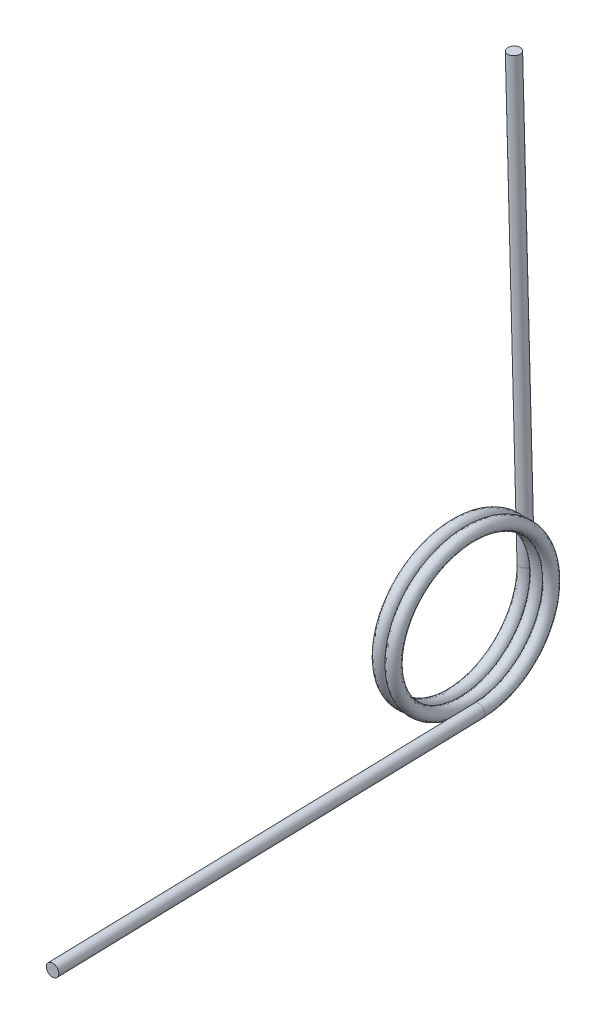
ISO-10303-21;
HEADER;
FILE_DESCRIPTION(('STEP AP214'),'2;1');
FILE_NAME('part.step','',(''),(''),'','','');
FILE_SCHEMA(('AUTOMOTIVE_DESIGN { 1 0 10303 214 1 1 1 1 }'));
ENDSEC;
DATA;
#1=APPLICATION_CONTEXT('core data for automotive mechanical design processes');
#2=APPLICATION_PROTOCOL_DEFINITION('international standard','automotive_design',2000,#1);
#3=PRODUCT_CONTEXT('',#1,'mechanical');
#4=PRODUCT('Part','Part','',(#3));
#5=PRODUCT_RELATED_PRODUCT_CATEGORY('part','',(#4));
#6=PRODUCT_DEFINITION_FORMATION('','',#4);
#7=PRODUCT_DEFINITION_CONTEXT('part definition',#1,'design');
#8=PRODUCT_DEFINITION('design','',#6,#7);
#9=PRODUCT_DEFINITION_SHAPE('','',#8);
#10=(LENGTH_UNIT() NAMED_UNIT(*) SI_UNIT(.MILLI.,.METRE.));
#11=(NAMED_UNIT(*) PLANE_ANGLE_UNIT() SI_UNIT($,.RADIAN.));
#12=(NAMED_UNIT(*) SI_UNIT($,.STERADIAN.) SOLID_ANGLE_UNIT());
#13=UNCERTAINTY_MEASURE_WITH_UNIT(LENGTH_MEASURE(1.E-05),#10,'distance_accuracy_value','');
#14=(GEOMETRIC_REPRESENTATION_CONTEXT(3) GLOBAL_UNCERTAINTY_ASSIGNED_CONTEXT((#13)) GLOBAL_UNIT_ASSIGNED_CONTEXT((#10,
#11,#12)) REPRESENTATION_CONTEXT('',''));
#15=CARTESIAN_POINT('',(0.,0.,0.));
#16=DIRECTION('',(0.,0.,1.));
#17=DIRECTION('',(1.,0.,0.));
#18=AXIS2_PLACEMENT_3D('',#15,#16,#17);
#19=CARTESIAN_POINT('',(-0.35547277961464,-4.3815,0.00951120145095867));
#20=CARTESIAN_POINT('',(-0.416856112947973,-4.38699129471803,-2.52014900300339));
#21=CARTESIAN_POINT('',(-0.478239446281306,-2.19898694207704,-3.78973470595604));
#22=CARTESIAN_POINT('',(-0.53962277961464,-0.0109825894360558,-5.05932040890869));
#23=CARTESIAN_POINT('',(-0.601006112947973,2.18251305792296,-3.799245907407));
#24=CARTESIAN_POINT('',(-0.662389446281306,4.37600870528197,-2.53917140590531));
#25=CARTESIAN_POINT('',(-0.723772779614639,4.3815,-0.0095112014509592));
#26=CARTESIAN_POINT('',(-0.785156112947972,4.38699129471803,2.52014900300339));
#27=CARTESIAN_POINT('',(-0.846539446281306,2.19898694207704,3.78973470595604));
#28=CARTESIAN_POINT('',(-0.907922779614639,0.0109825894360564,5.05932040890869));
#29=CARTESIAN_POINT('',(-0.969306112947972,-2.18251305792296,3.799245907407));
#30=CARTESIAN_POINT('',(-1.0306894462813,-4.37600870528197,2.53917140590531));
#31=CARTESIAN_POINT('',(-1.09207277961464,-4.3815,0.00951120145095867));
#32=CARTESIAN_POINT('',(-1.15345611294797,-4.38699129471803,-2.52014900300339));
#33=CARTESIAN_POINT('',(-1.2148394462813,-2.19898694207704,-3.78973470595604));
#34=CARTESIAN_POINT('',(-1.27622277961464,-0.0109825894360558,-5.05932040890869));
#35=CARTESIAN_POINT('',(-1.33760611294797,2.18251305792296,-3.799245907407));
#36=CARTESIAN_POINT('',(-1.3989894462813,4.37600870528197,-2.53917140590531));
#37=CARTESIAN_POINT('',(-1.46037277961464,4.3815,-0.0095112014509592));
#38=CARTESIAN_POINT('',(-1.52175611294797,4.38699129471803,2.52014900300339));
#39=CARTESIAN_POINT('',(-1.5831394462813,2.19898694207704,3.78973470595604));
#40=CARTESIAN_POINT('',(-1.64452277961464,0.0109825894360564,5.05932040890869));
#41=CARTESIAN_POINT('',(-1.70590611294797,-2.18251305792296,3.799245907407));
#42=CARTESIAN_POINT('',(-1.7672894462813,-4.37600870528197,2.53917140590531));
#43=CARTESIAN_POINT('',(-1.82867277961464,-4.3815,0.00951120145095867));
#44=CARTESIAN_POINT('',(-1.89005611294797,-4.38699129471803,-2.52014900300339));
#45=CARTESIAN_POINT('',(-1.9514394462813,-2.19898694207704,-3.78973470595604));
#46=CARTESIAN_POINT('',(-2.01282277961464,-0.0109825894360558,-5.05932040890869));
#47=CARTESIAN_POINT('',(-2.07420611294797,2.18251305792296,-3.799245907407));
#48=CARTESIAN_POINT('',(-2.1355894462813,4.37600870528197,-2.53917140590531));
#49=CARTESIAN_POINT('',(-2.19697277961464,4.3815,-0.0095112014509592));
#50=CARTESIAN_POINT('',(-2.25835611294797,4.38699129471803,2.52014900300339));
#51=CARTESIAN_POINT('',(-2.3197394462813,2.19898694207704,3.78973470595604));
#52=CARTESIAN_POINT('',(-2.38112277961464,0.0109825894360564,5.05932040890869));
#53=CARTESIAN_POINT('',(-2.44250611294797,-2.18251305792296,3.799245907407));
#54=CARTESIAN_POINT('',(-2.5038894462813,-4.37600870528197,2.53917140590531));
#55=CARTESIAN_POINT('',(-2.56527277961463,-4.3815,0.00951120145095867));
#56=CARTESIAN_POINT('',(-0.35547277961464,-3.6703,0.00951120145096624));
#57=CARTESIAN_POINT('',(-0.416856112947973,-3.67579129471803,-2.10953749155572));
#58=CARTESIAN_POINT('',(-0.478239446281306,-1.84338694207705,-3.17381743878454));
#59=CARTESIAN_POINT('',(-0.539622779614639,-0.0109825894360645,-4.23809738601337));
#60=CARTESIAN_POINT('',(-0.601006112947973,1.82691305792295,-3.18332864023551));
#61=CARTESIAN_POINT('',(-0.662389446281306,3.66480870528197,-2.12855989445765));
#62=CARTESIAN_POINT('',(-0.723772779614639,3.6703,-0.00951120145096669));
#63=CARTESIAN_POINT('',(-0.785156112947972,3.67579129471804,2.10953749155572));
#64=CARTESIAN_POINT('',(-0.846539446281305,1.84338694207705,3.17381743878454));
#65=CARTESIAN_POINT('',(-0.907922779614639,0.010982589436065,4.23809738601337));
#66=CARTESIAN_POINT('',(-0.969306112947972,-1.82691305792295,3.18332864023551));
#67=CARTESIAN_POINT('',(-1.0306894462813,-3.66480870528197,2.12855989445765));
#68=CARTESIAN_POINT('',(-1.09207277961464,-3.6703,0.00951120145096624));
#69=CARTESIAN_POINT('',(-1.15345611294797,-3.67579129471803,-2.10953749155572));
#70=CARTESIAN_POINT('',(-1.2148394462813,-1.84338694207705,-3.17381743878454));
#71=CARTESIAN_POINT('',(-1.27622277961464,-0.0109825894360645,-4.23809738601337));
#72=CARTESIAN_POINT('',(-1.33760611294797,1.82691305792295,-3.18332864023551));
#73=CARTESIAN_POINT('',(-1.3989894462813,3.66480870528197,-2.12855989445765));
#74=CARTESIAN_POINT('',(-1.46037277961464,3.6703,-0.00951120145096669));
#75=CARTESIAN_POINT('',(-1.52175611294797,3.67579129471804,2.10953749155572));
#76=CARTESIAN_POINT('',(-1.5831394462813,1.84338694207705,3.17381743878454));
#77=CARTESIAN_POINT('',(-1.64452277961464,0.010982589436065,4.23809738601337));
#78=CARTESIAN_POINT('',(-1.70590611294797,-1.82691305792295,3.18332864023551));
#79=CARTESIAN_POINT('',(-1.7672894462813,-3.66480870528197,2.12855989445765));
#80=CARTESIAN_POINT('',(-1.82867277961464,-3.6703,0.00951120145096624));
#81=CARTESIAN_POINT('',(-1.89005611294797,-3.67579129471803,-2.10953749155572));
#82=CARTESIAN_POINT('',(-1.9514394462813,-1.84338694207705,-3.17381743878454));
#83=CARTESIAN_POINT('',(-2.01282277961464,-0.0109825894360645,-4.23809738601337));
#84=CARTESIAN_POINT('',(-2.07420611294797,1.82691305792295,-3.18332864023551));
#85=CARTESIAN_POINT('',(-2.1355894462813,3.66480870528197,-2.12855989445765));
#86=CARTESIAN_POINT('',(-2.19697277961464,3.6703,-0.00951120145096669));
#87=CARTESIAN_POINT('',(-2.25835611294797,3.67579129471804,2.10953749155572));
#88=CARTESIAN_POINT('',(-2.3197394462813,1.84338694207705,3.17381743878454));
#89=CARTESIAN_POINT('',(-2.38112277961464,0.010982589436065,4.23809738601337));
#90=CARTESIAN_POINT('',(-2.44250611294797,-1.82691305792295,3.18332864023551));
#91=CARTESIAN_POINT('',(-2.5038894462813,-3.66480870528197,2.12855989445765));
#92=CARTESIAN_POINT('',(-2.56527277961463,-3.6703,0.00951120145096624));
#93=CARTESIAN_POINT('',(0.35547277961464,-3.6703,-0.00951120145104288));
#94=CARTESIAN_POINT('',(0.294089446281307,-3.66480870528193,-2.12855989445773));
#95=CARTESIAN_POINT('',(0.232706112947974,-1.82691305792289,-3.18332864023555));
#96=CARTESIAN_POINT('',(0.171322779614641,0.0109825894361525,-4.23809738601337));
#97=CARTESIAN_POINT('',(0.109939446281307,1.84338694207711,-3.17381743878451));
#98=CARTESIAN_POINT('',(0.0485561129479742,3.67579129471808,-2.10953749155564));
#99=CARTESIAN_POINT('',(-0.012827220385359,3.6703,0.00951120145104243));
#100=CARTESIAN_POINT('',(-0.0742105537186922,3.66480870528193,2.12855989445773));
#101=CARTESIAN_POINT('',(-0.135593887052025,1.82691305792289,3.18332864023555));
#102=CARTESIAN_POINT('',(-0.196977220385359,-0.0109825894361519,4.23809738601337));
#103=CARTESIAN_POINT('',(-0.258360553718692,-1.84338694207711,3.17381743878451));
#104=CARTESIAN_POINT('',(-0.319743887052025,-3.67579129471808,2.10953749155564));
#105=CARTESIAN_POINT('',(-0.381127220385358,-3.6703,-0.00951120145104288));
#106=CARTESIAN_POINT('',(-0.442510553718691,-3.66480870528193,-2.12855989445773));
#107=CARTESIAN_POINT('',(-0.503893887052025,-1.82691305792289,-3.18332864023555));
#108=CARTESIAN_POINT('',(-0.565277220385358,0.0109825894361525,-4.23809738601337));
#109=CARTESIAN_POINT('',(-0.626660553718691,1.84338694207711,-3.17381743878451));
#110=CARTESIAN_POINT('',(-0.688043887052024,3.67579129471808,-2.10953749155564));
#111=CARTESIAN_POINT('',(-0.749427220385357,3.6703,0.00951120145104243));
#112=CARTESIAN_POINT('',(-0.810810553718691,3.66480870528193,2.12855989445773));
#113=CARTESIAN_POINT('',(-0.872193887052024,1.82691305792289,3.18332864023555));
#114=CARTESIAN_POINT('',(-0.933577220385357,-0.0109825894361519,4.23809738601337));
#115=CARTESIAN_POINT('',(-0.99496055371869,-1.84338694207711,3.17381743878451));
#116=CARTESIAN_POINT('',(-1.05634388705202,-3.67579129471808,2.10953749155564));
#117=CARTESIAN_POINT('',(-1.11772722038536,-3.6703,-0.00951120145104288));
#118=CARTESIAN_POINT('',(-1.17911055371869,-3.66480870528193,-2.12855989445773));
#119=CARTESIAN_POINT('',(-1.24049388705202,-1.82691305792289,-3.18332864023555));
#120=CARTESIAN_POINT('',(-1.30187722038536,0.0109825894361525,-4.23809738601337));
#121=CARTESIAN_POINT('',(-1.36326055371869,1.84338694207711,-3.17381743878451));
#122=CARTESIAN_POINT('',(-1.42464388705202,3.67579129471808,-2.10953749155564));
#123=CARTESIAN_POINT('',(-1.48602722038536,3.6703,0.00951120145104243));
#124=CARTESIAN_POINT('',(-1.54741055371869,3.66480870528193,2.12855989445773));
#125=CARTESIAN_POINT('',(-1.60879388705202,1.82691305792289,3.18332864023555));
#126=CARTESIAN_POINT('',(-1.67017722038536,-0.0109825894361519,4.23809738601337));
#127=CARTESIAN_POINT('',(-1.73156055371869,-1.84338694207711,3.17381743878451));
#128=CARTESIAN_POINT('',(-1.79294388705202,-3.67579129471808,2.10953749155564));
#129=CARTESIAN_POINT('',(-1.85432722038535,-3.6703,-0.00951120145104288));
#130=CARTESIAN_POINT('',(0.35547277961464,-4.3815,-0.00951120145105045));
#131=CARTESIAN_POINT('',(0.294089446281307,-4.37600870528192,-2.5391714059054));
#132=CARTESIAN_POINT('',(0.232706112947974,-2.18251305792288,-3.79924590740704));
#133=CARTESIAN_POINT('',(0.17132277961464,0.0109825894361612,-5.05932040890869));
#134=CARTESIAN_POINT('',(0.109939446281307,2.19898694207712,-3.78973470595599));
#135=CARTESIAN_POINT('',(0.0485561129479741,4.38699129471808,-2.5201490030033));
#136=CARTESIAN_POINT('',(-0.0128272203853591,4.3815,0.00951120145104991));
#137=CARTESIAN_POINT('',(-0.0742105537186923,4.37600870528192,2.5391714059054));
#138=CARTESIAN_POINT('',(-0.135593887052026,2.18251305792288,3.79924590740704));
#139=CARTESIAN_POINT('',(-0.196977220385359,-0.0109825894361605,5.05932040890869));
#140=CARTESIAN_POINT('',(-0.258360553718692,-2.19898694207712,3.789734705956));
#141=CARTESIAN_POINT('',(-0.319743887052025,-4.38699129471808,2.5201490030033));
#142=CARTESIAN_POINT('',(-0.381127220385358,-4.3815,-0.00951120145105045));
#143=CARTESIAN_POINT('',(-0.442510553718692,-4.37600870528192,-2.5391714059054));
#144=CARTESIAN_POINT('',(-0.503893887052025,-2.18251305792288,-3.79924590740704));
#145=CARTESIAN_POINT('',(-0.565277220385358,0.0109825894361612,-5.05932040890869));
#146=CARTESIAN_POINT('',(-0.626660553718691,2.19898694207712,-3.78973470595599));
#147=CARTESIAN_POINT('',(-0.688043887052024,4.38699129471808,-2.5201490030033));
#148=CARTESIAN_POINT('',(-0.749427220385357,4.3815,0.00951120145104991));
#149=CARTESIAN_POINT('',(-0.810810553718691,4.37600870528192,2.5391714059054));
#150=CARTESIAN_POINT('',(-0.872193887052024,2.18251305792288,3.79924590740704));
#151=CARTESIAN_POINT('',(-0.933577220385357,-0.0109825894361605,5.05932040890869));
#152=CARTESIAN_POINT('',(-0.99496055371869,-2.19898694207712,3.789734705956));
#153=CARTESIAN_POINT('',(-1.05634388705202,-4.38699129471808,2.5201490030033));
#154=CARTESIAN_POINT('',(-1.11772722038536,-4.3815,-0.00951120145105045));
#155=CARTESIAN_POINT('',(-1.17911055371869,-4.37600870528192,-2.5391714059054));
#156=CARTESIAN_POINT('',(-1.24049388705202,-2.18251305792288,-3.79924590740704));
#157=CARTESIAN_POINT('',(-1.30187722038536,0.0109825894361612,-5.05932040890869));
#158=CARTESIAN_POINT('',(-1.36326055371869,2.19898694207712,-3.78973470595599));
#159=CARTESIAN_POINT('',(-1.42464388705202,4.38699129471808,-2.5201490030033));
#160=CARTESIAN_POINT('',(-1.48602722038536,4.3815,0.00951120145104991));
#161=CARTESIAN_POINT('',(-1.54741055371869,4.37600870528192,2.5391714059054));
#162=CARTESIAN_POINT('',(-1.60879388705202,2.18251305792288,3.79924590740704));
#163=CARTESIAN_POINT('',(-1.67017722038536,-0.0109825894361605,5.05932040890869));
#164=CARTESIAN_POINT('',(-1.73156055371869,-2.19898694207712,3.789734705956));
#165=CARTESIAN_POINT('',(-1.79294388705202,-4.38699129471808,2.5201490030033));
#166=CARTESIAN_POINT('',(-1.85432722038535,-4.3815,-0.00951120145105045));
#167=CARTESIAN_POINT('',(0.35547277961464,-5.0927,-0.00951120145105802));
#168=CARTESIAN_POINT('',(0.294089446281307,-5.08720870528192,-2.94978291735307));
#169=CARTESIAN_POINT('',(0.232706112947974,-2.53811305792287,-4.41516317457854));
#170=CARTESIAN_POINT('',(0.17132277961464,0.0109825894361699,-5.88054343180402));
#171=CARTESIAN_POINT('',(0.109939446281307,2.55458694207713,-4.40565197312748));
#172=CARTESIAN_POINT('',(0.0485561129479739,5.09819129471809,-2.93076051445095));
#173=CARTESIAN_POINT('',(-0.0128272203853592,5.0927,0.0095112014510574));
#174=CARTESIAN_POINT('',(-0.0742105537186924,5.08720870528192,2.94978291735306));
#175=CARTESIAN_POINT('',(-0.135593887052026,2.53811305792288,4.41516317457854));
#176=CARTESIAN_POINT('',(-0.196977220385359,-0.0109825894361691,5.88054343180402));
#177=CARTESIAN_POINT('',(-0.258360553718692,-2.55458694207713,4.40565197312749));
#178=CARTESIAN_POINT('',(-0.319743887052025,-5.09819129471809,2.93076051445095));
#179=CARTESIAN_POINT('',(-0.381127220385358,-5.0927,-0.00951120145105802));
#180=CARTESIAN_POINT('',(-0.442510553718692,-5.08720870528192,-2.94978291735307));
#181=CARTESIAN_POINT('',(-0.503893887052025,-2.53811305792287,-4.41516317457854));
#182=CARTESIAN_POINT('',(-0.565277220385358,0.0109825894361699,-5.88054343180402));
#183=CARTESIAN_POINT('',(-0.626660553718691,2.55458694207713,-4.40565197312748));
#184=CARTESIAN_POINT('',(-0.688043887052024,5.09819129471809,-2.93076051445095));
#185=CARTESIAN_POINT('',(-0.749427220385358,5.0927,0.0095112014510574));
#186=CARTESIAN_POINT('',(-0.810810553718691,5.08720870528192,2.94978291735306));
#187=CARTESIAN_POINT('',(-0.872193887052024,2.53811305792288,4.41516317457854));
#188=CARTESIAN_POINT('',(-0.933577220385357,-0.0109825894361691,5.88054343180402));
#189=CARTESIAN_POINT('',(-0.99496055371869,-2.55458694207713,4.40565197312749));
#190=CARTESIAN_POINT('',(-1.05634388705202,-5.09819129471809,2.93076051445095));
#191=CARTESIAN_POINT('',(-1.11772722038536,-5.0927,-0.00951120145105802));
#192=CARTESIAN_POINT('',(-1.17911055371869,-5.08720870528192,-2.94978291735307));
#193=CARTESIAN_POINT('',(-1.24049388705202,-2.53811305792287,-4.41516317457854));
#194=CARTESIAN_POINT('',(-1.30187722038536,0.0109825894361699,-5.88054343180402));
#195=CARTESIAN_POINT('',(-1.36326055371869,2.55458694207713,-4.40565197312748));
#196=CARTESIAN_POINT('',(-1.42464388705202,5.09819129471809,-2.93076051445095));
#197=CARTESIAN_POINT('',(-1.48602722038536,5.0927,0.0095112014510574));
#198=CARTESIAN_POINT('',(-1.54741055371869,5.08720870528192,2.94978291735306));
#199=CARTESIAN_POINT('',(-1.60879388705202,2.53811305792288,4.41516317457854));
#200=CARTESIAN_POINT('',(-1.67017722038536,-0.0109825894361691,5.88054343180402));
#201=CARTESIAN_POINT('',(-1.73156055371869,-2.55458694207713,4.40565197312749));
#202=CARTESIAN_POINT('',(-1.79294388705202,-5.09819129471809,2.93076051445095));
#203=CARTESIAN_POINT('',(-1.85432722038536,-5.0927,-0.00951120145105802));
#204=CARTESIAN_POINT('',(-0.35547277961464,-5.0927,0.00951120145095109));
#205=CARTESIAN_POINT('',(-0.416856112947973,-5.09819129471803,-2.93076051445106));
#206=CARTESIAN_POINT('',(-0.478239446281307,-2.55458694207704,-4.40565197312754));
#207=CARTESIAN_POINT('',(-0.53962277961464,-0.0109825894360471,-5.88054343180402));
#208=CARTESIAN_POINT('',(-0.601006112947973,2.53811305792296,-4.41516317457849));
#209=CARTESIAN_POINT('',(-0.662389446281306,5.08720870528198,-2.94978291735296));
#210=CARTESIAN_POINT('',(-0.723772779614639,5.0927,-0.00951120145095172));
#211=CARTESIAN_POINT('',(-0.785156112947972,5.09819129471803,2.93076051445106));
#212=CARTESIAN_POINT('',(-0.846539446281306,2.55458694207704,4.40565197312753));
#213=CARTESIAN_POINT('',(-0.907922779614639,0.0109825894360478,5.88054343180402));
#214=CARTESIAN_POINT('',(-0.969306112947972,-2.53811305792296,4.41516317457849));
#215=CARTESIAN_POINT('',(-1.03068944628131,-5.08720870528198,2.94978291735296));
#216=CARTESIAN_POINT('',(-1.09207277961464,-5.0927,0.00951120145095109));
#217=CARTESIAN_POINT('',(-1.15345611294797,-5.09819129471803,-2.93076051445106));
#218=CARTESIAN_POINT('',(-1.21483944628131,-2.55458694207704,-4.40565197312754));
#219=CARTESIAN_POINT('',(-1.27622277961464,-0.0109825894360471,-5.88054343180402));
#220=CARTESIAN_POINT('',(-1.33760611294797,2.53811305792296,-4.41516317457849));
#221=CARTESIAN_POINT('',(-1.3989894462813,5.08720870528198,-2.94978291735296));
#222=CARTESIAN_POINT('',(-1.46037277961464,5.0927,-0.00951120145095172));
#223=CARTESIAN_POINT('',(-1.52175611294797,5.09819129471803,2.93076051445106));
#224=CARTESIAN_POINT('',(-1.5831394462813,2.55458694207704,4.40565197312753));
#225=CARTESIAN_POINT('',(-1.64452277961464,0.0109825894360478,5.88054343180402));
#226=CARTESIAN_POINT('',(-1.70590611294797,-2.53811305792296,4.41516317457849));
#227=CARTESIAN_POINT('',(-1.7672894462813,-5.08720870528198,2.94978291735296));
#228=CARTESIAN_POINT('',(-1.82867277961464,-5.0927,0.00951120145095109));
#229=CARTESIAN_POINT('',(-1.89005611294797,-5.09819129471803,-2.93076051445106));
#230=CARTESIAN_POINT('',(-1.9514394462813,-2.55458694207704,-4.40565197312754));
#231=CARTESIAN_POINT('',(-2.01282277961464,-0.0109825894360471,-5.88054343180402));
#232=CARTESIAN_POINT('',(-2.07420611294797,2.53811305792296,-4.41516317457849));
#233=CARTESIAN_POINT('',(-2.1355894462813,5.08720870528198,-2.94978291735296));
#234=CARTESIAN_POINT('',(-2.19697277961464,5.0927,-0.00951120145095172));
#235=CARTESIAN_POINT('',(-2.25835611294797,5.09819129471803,2.93076051445106));
#236=CARTESIAN_POINT('',(-2.3197394462813,2.55458694207704,4.40565197312753));
#237=CARTESIAN_POINT('',(-2.38112277961464,0.0109825894360478,5.88054343180402));
#238=CARTESIAN_POINT('',(-2.44250611294797,-2.53811305792296,4.41516317457849));
#239=CARTESIAN_POINT('',(-2.5038894462813,-5.08720870528198,2.94978291735296));
#240=CARTESIAN_POINT('',(-2.56527277961463,-5.0927,0.00951120145095109));
#241=CARTESIAN_POINT('',(-0.35547277961464,-4.3815,0.00951120145095867));
#242=CARTESIAN_POINT('',(-0.416856112947973,-4.38699129471803,-2.52014900300339));
#243=CARTESIAN_POINT('',(-0.478239446281306,-2.19898694207704,-3.78973470595604));
#244=CARTESIAN_POINT('',(-0.53962277961464,-0.0109825894360558,-5.05932040890869));
#245=CARTESIAN_POINT('',(-0.601006112947973,2.18251305792296,-3.799245907407));
#246=CARTESIAN_POINT('',(-0.662389446281306,4.37600870528197,-2.53917140590531));
#247=CARTESIAN_POINT('',(-0.723772779614639,4.3815,-0.0095112014509592));
#248=CARTESIAN_POINT('',(-0.785156112947972,4.38699129471803,2.52014900300339));
#249=CARTESIAN_POINT('',(-0.846539446281306,2.19898694207704,3.78973470595604));
#250=CARTESIAN_POINT('',(-0.907922779614639,0.0109825894360564,5.05932040890869));
#251=CARTESIAN_POINT('',(-0.969306112947972,-2.18251305792296,3.799245907407));
#252=CARTESIAN_POINT('',(-1.0306894462813,-4.37600870528197,2.53917140590531));
#253=CARTESIAN_POINT('',(-1.09207277961464,-4.3815,0.00951120145095867));
#254=CARTESIAN_POINT('',(-1.15345611294797,-4.38699129471803,-2.52014900300339));
#255=CARTESIAN_POINT('',(-1.2148394462813,-2.19898694207704,-3.78973470595604));
#256=CARTESIAN_POINT('',(-1.27622277961464,-0.0109825894360558,-5.05932040890869));
#257=CARTESIAN_POINT('',(-1.33760611294797,2.18251305792296,-3.799245907407));
#258=CARTESIAN_POINT('',(-1.3989894462813,4.37600870528197,-2.53917140590531));
#259=CARTESIAN_POINT('',(-1.46037277961464,4.3815,-0.0095112014509592));
#260=CARTESIAN_POINT('',(-1.52175611294797,4.38699129471803,2.52014900300339));
#261=CARTESIAN_POINT('',(-1.5831394462813,2.19898694207704,3.78973470595604));
#262=CARTESIAN_POINT('',(-1.64452277961464,0.0109825894360564,5.05932040890869));
#263=CARTESIAN_POINT('',(-1.70590611294797,-2.18251305792296,3.799245907407));
#264=CARTESIAN_POINT('',(-1.7672894462813,-4.37600870528197,2.53917140590531));
#265=CARTESIAN_POINT('',(-1.82867277961464,-4.3815,0.00951120145095867));
#266=CARTESIAN_POINT('',(-1.89005611294797,-4.38699129471803,-2.52014900300339));
#267=CARTESIAN_POINT('',(-1.9514394462813,-2.19898694207704,-3.78973470595604));
#268=CARTESIAN_POINT('',(-2.01282277961464,-0.0109825894360558,-5.05932040890869));
#269=CARTESIAN_POINT('',(-2.07420611294797,2.18251305792296,-3.799245907407));
#270=CARTESIAN_POINT('',(-2.1355894462813,4.37600870528197,-2.53917140590531));
#271=CARTESIAN_POINT('',(-2.19697277961464,4.3815,-0.0095112014509592));
#272=CARTESIAN_POINT('',(-2.25835611294797,4.38699129471803,2.52014900300339));
#273=CARTESIAN_POINT('',(-2.3197394462813,2.19898694207704,3.78973470595604));
#274=CARTESIAN_POINT('',(-2.38112277961464,0.0109825894360564,5.05932040890869));
#275=CARTESIAN_POINT('',(-2.44250611294797,-2.18251305792296,3.799245907407));
#276=CARTESIAN_POINT('',(-2.5038894462813,-4.37600870528197,2.53917140590531));
#277=CARTESIAN_POINT('',(-2.56527277961463,-4.3815,0.00951120145095867));
#278=(BOUNDED_SURFACE() B_SPLINE_SURFACE(3,2,((#19,#20,#21,#22,#23,#24,#25,#26,#27,#28,#29,#30,
#31,#32,#33,#34,#35,#36,#37,#38,#39,#40,#41,#42,#43,#44,#45,#46,#47,#48,#49,#50,#51,#52,#53,#54,
#55),(#56,#57,#58,#59,#60,#61,#62,#63,#64,#65,#66,#67,#68,#69,#70,#71,#72,#73,#74,#75,#76,#77,
#78,#79,#80,#81,#82,#83,#84,#85,#86,#87,#88,#89,#90,#91,#92),(#93,#94,#95,#96,#97,#98,#99,#100,
#101,#102,#103,#104,#105,#106,#107,#108,#109,#110,#111,#112,#113,#114,#115,#116,#117,#118,#119,
#120,#121,#122,#123,#124,#125,#126,#127,#128,#129),(#130,#131,#132,#133,#134,#135,#136,#137,
#138,#139,#140,#141,#142,#143,#144,#145,#146,#147,#148,#149,#150,#151,#152,#153,#154,#155,#156,
#157,#158,#159,#160,#161,#162,#163,#164,#165,#166),(#167,#168,#169,#170,#171,#172,#173,#174,
#175,#176,#177,#178,#179,#180,#181,#182,#183,#184,#185,#186,#187,#188,#189,#190,#191,#192,#193,
#194,#195,#196,#197,#198,#199,#200,#201,#202,#203),(#204,#205,#206,#207,#208,#209,#210,#211,
#212,#213,#214,#215,#216,#217,#218,#219,#220,#221,#222,#223,#224,#225,#226,#227,#228,#229,#230,
#231,#232,#233,#234,#235,#236,#237,#238,#239,#240),(#241,#242,#243,#244,#245,#246,#247,#248,
#249,#250,#251,#252,#253,#254,#255,#256,#257,#258,#259,#260,#261,#262,#263,#264,#265,#266,#267,
#268,#269,#270,#271,#272,#273,#274,#275,#276,#277)),.UNSPECIFIED.,.T.,.F.,
.F.) B_SPLINE_SURFACE_WITH_KNOTS((4,3,4),(3,2,2,2,2,2,2,2,2,2,2,2,2,2,2,2,2,2,3),(0.,0.5,1.),
(0.,0.0555555555555556,0.111111111111111,0.166666666666667,0.222222222222222,0.277777777777778,
0.333333333333333,0.388888888888889,0.444444444444444,0.5,0.555555555555556,0.611111111111111,
0.666666666666667,0.722222222222222,0.777777777777778,0.833333333333333,0.888888888888889,
0.944444444444444,1.),
.UNSPECIFIED.) GEOMETRIC_REPRESENTATION_ITEM() RATIONAL_B_SPLINE_SURFACE(((1.,0.866025403784439,
1.,0.866025403784439,1.,0.866025403784439,1.,0.866025403784439,1.,0.866025403784439,1.,
0.866025403784439,1.,0.866025403784439,1.,0.866025403784439,1.,0.866025403784439,1.,
0.866025403784439,1.,0.866025403784439,1.,0.866025403784439,1.,0.866025403784439,1.,
0.866025403784439,1.,0.866025403784439,1.,0.866025403784439,1.,0.866025403784439,1.,
0.866025403784439,1.),(0.333333333333333,0.288675134594813,0.333333333333333,0.288675134594813,
0.333333333333333,0.288675134594813,0.333333333333333,0.288675134594813,0.333333333333333,
0.288675134594813,0.333333333333333,0.288675134594813,0.333333333333333,0.288675134594813,
0.333333333333333,0.288675134594813,0.333333333333333,0.288675134594813,0.333333333333333,
0.288675134594813,0.333333333333333,0.288675134594813,0.333333333333333,0.288675134594813,
0.333333333333333,0.288675134594813,0.333333333333333,0.288675134594813,0.333333333333333,
0.288675134594813,0.333333333333333,0.288675134594813,0.333333333333333,0.288675134594813,
0.333333333333333,0.288675134594813,0.333333333333333),(0.333333333333333,0.288675134594813,
0.333333333333333,0.288675134594813,0.333333333333333,0.288675134594813,0.333333333333333,
0.288675134594813,0.333333333333333,0.288675134594813,0.333333333333333,0.288675134594813,
0.333333333333333,0.288675134594813,0.333333333333333,0.288675134594813,0.333333333333333,
0.288675134594813,0.333333333333333,0.288675134594813,0.333333333333333,0.288675134594813,
0.333333333333333,0.288675134594813,0.333333333333333,0.288675134594813,0.333333333333333,
0.288675134594813,0.333333333333333,0.288675134594813,0.333333333333333,0.288675134594813,
0.333333333333333,0.288675134594813,0.333333333333333,0.288675134594813,0.333333333333333),(1.,
0.866025403784439,1.,0.866025403784439,1.,0.866025403784439,1.,0.866025403784439,1.,
0.866025403784439,1.,0.866025403784439,1.,0.866025403784439,1.,0.866025403784439,1.,
0.866025403784439,1.,0.866025403784439,1.,0.866025403784439,1.,0.866025403784439,1.,
0.866025403784439,1.,0.866025403784439,1.,0.866025403784439,1.,0.866025403784439,1.,
0.866025403784439,1.,0.866025403784439,1.),(0.333333333333333,0.288675134594813,
0.333333333333333,0.288675134594813,0.333333333333333,0.288675134594813,0.333333333333333,
0.288675134594813,0.333333333333333,0.288675134594813,0.333333333333333,0.288675134594813,
0.333333333333333,0.288675134594813,0.333333333333333,0.288675134594813,0.333333333333333,
0.288675134594813,0.333333333333333,0.288675134594813,0.333333333333333,0.288675134594813,
0.333333333333333,0.288675134594813,0.333333333333333,0.288675134594813,0.333333333333333,
0.288675134594813,0.333333333333333,0.288675134594813,0.333333333333333,0.288675134594813,
0.333333333333333,0.288675134594813,0.333333333333333,0.288675134594813,0.333333333333333),
(0.333333333333333,0.288675134594813,0.333333333333333,0.288675134594813,0.333333333333333,
0.288675134594813,0.333333333333333,0.288675134594813,0.333333333333333,0.288675134594813,
0.333333333333333,0.288675134594813,0.333333333333333,0.288675134594813,0.333333333333333,
0.288675134594813,0.333333333333333,0.288675134594813,0.333333333333333,0.288675134594813,
0.333333333333333,0.288675134594813,0.333333333333333,0.288675134594813,0.333333333333333,
0.288675134594813,0.333333333333333,0.288675134594813,0.333333333333333,0.288675134594813,
0.333333333333333,0.288675134594813,0.333333333333333,0.288675134594813,0.333333333333333,
0.288675134594813,0.333333333333333),(1.,0.866025403784439,1.,0.866025403784439,1.,
0.866025403784439,1.,0.866025403784439,1.,0.866025403784439,1.,0.866025403784439,1.,
0.866025403784439,1.,0.866025403784439,1.,0.866025403784439,1.,0.866025403784439,1.,
0.866025403784439,1.,0.866025403784439,1.,0.866025403784439,1.,0.866025403784439,1.,
0.866025403784439,1.,0.866025403784439,1.,0.866025403784439,1.,0.866025403784439,1.))) REPRESENTATION_ITEM('') SURFACE());
#279=CARTESIAN_POINT('',(-1.65735,1.91357144845568E-13,-4.3815));
#280=DIRECTION('',(-0.0267469107171107,0.999642237386502,0.));
#281=DIRECTION('',(-0.999642237386502,-0.0267469107171107,0.));
#282=AXIS2_PLACEMENT_3D('',#279,#280,#281);
#283=CIRCLE('',#282,0.3556);
#284=CARTESIAN_POINT('',(-2.01282277961464,-0.0095112014508132,-4.3815));
#285=VERTEX_POINT('',#284);
#286=EDGE_CURVE('E10',#285,#285,#283,.T.);
#287=CARTESIAN_POINT('',(0.,-4.3815,0.));
#288=DIRECTION('',(0.0267469107171107,0.,0.999642237386502));
#289=DIRECTION('',(0.999642237386502,0.,-0.0267469107171107));
#290=AXIS2_PLACEMENT_3D('',#287,#288,#289);
#291=CIRCLE('',#290,0.3556);
#292=CARTESIAN_POINT('',(0.35547277961464,-4.3815,-0.00951120145105124));
#293=VERTEX_POINT('',#292);
#294=EDGE_CURVE('E42',#293,#293,#291,.T.);
#295=ORIENTED_EDGE('',*,*,#286,.F.);
#296=EDGE_LOOP('',(#295));
#297=FACE_BOUND('',#296,.T.);
#298=ORIENTED_EDGE('',*,*,#294,.F.);
#299=EDGE_LOOP('',(#298));
#300=FACE_BOUND('',#299,.T.);
#301=ADVANCED_FACE('F30',(#297,#300),#278,.T.);
#302=CARTESIAN_POINT('',(0.679371532214611,-4.38150000000027,25.3909128296171));
#303=DIRECTION('',(-0.0267469107171107,0.,-0.999642237386502));
#304=DIRECTION('',(-0.999642237386502,0.,0.0267469107171107));
#305=AXIS2_PLACEMENT_3D('',#302,#303,#304);
#306=CYLINDRICAL_SURFACE('',#305,0.3556);
#307=CARTESIAN_POINT('',(0.679371532214611,-4.38150000000027,25.3909128296171));
#308=DIRECTION('',(0.0267469107171107,0.,0.999642237386502));
#309=DIRECTION('',(0.999642237386502,0.,-0.0267469107171107));
#310=AXIS2_PLACEMENT_3D('',#307,#308,#309);
#311=CIRCLE('',#310,0.3556);
#312=CARTESIAN_POINT('',(1.03484431182925,-4.38150000000027,25.3814016281661));
#313=VERTEX_POINT('',#312);
#314=EDGE_CURVE('E38',#313,#313,#311,.T.);
#315=ORIENTED_EDGE('',*,*,#314,.F.);
#316=EDGE_LOOP('',(#315));
#317=FACE_BOUND('',#316,.T.);
#318=ORIENTED_EDGE('',*,*,#294,.T.);
#319=EDGE_LOOP('',(#318));
#320=FACE_BOUND('',#319,.T.);
#321=ADVANCED_FACE('F63',(#317,#320),#306,.T.);
#322=CARTESIAN_POINT('',(0.679371532214611,-4.38150000000027,25.3909128296171));
#323=DIRECTION('',(0.0267469107171107,0.,0.999642237386502));
#324=DIRECTION('',(0.999642237386502,0.,-0.0267469107171107));
#325=AXIS2_PLACEMENT_3D('',#322,#323,#324);
#326=PLANE('',#325);
#327=ORIENTED_EDGE('',*,*,#314,.T.);
#328=EDGE_LOOP('',(#327));
#329=FACE_BOUND('',#328,.T.);
#330=ADVANCED_FACE('F56',(#329),#326,.T.);
#331=CARTESIAN_POINT('',(-2.33672153221461,25.3909128296173,-4.38149999999889));
#332=DIRECTION('',(0.0267469107171107,-0.999642237386502,0.));
#333=DIRECTION('',(0.999642237386502,0.0267469107171107,0.));
#334=AXIS2_PLACEMENT_3D('',#331,#332,#333);
#335=CYLINDRICAL_SURFACE('',#334,0.355600000000001);
#336=CARTESIAN_POINT('',(-2.33672153221461,25.3909128296173,-4.38149999999889));
#337=DIRECTION('',(-0.0267469107171107,0.999642237386502,0.));
#338=DIRECTION('',(-0.999642237386502,-0.0267469107171107,0.));
#339=AXIS2_PLACEMENT_3D('',#336,#337,#338);
#340=CIRCLE('',#339,0.355600000000001);
#341=CARTESIAN_POINT('',(-2.69219431182925,25.3814016281663,-4.38149999999889));
#342=VERTEX_POINT('',#341);
#343=EDGE_CURVE('E47',#342,#342,#340,.T.);
#344=ORIENTED_EDGE('',*,*,#343,.F.);
#345=EDGE_LOOP('',(#344));
#346=FACE_BOUND('',#345,.T.);
#347=ORIENTED_EDGE('',*,*,#286,.T.);
#348=EDGE_LOOP('',(#347));
#349=FACE_BOUND('',#348,.T.);
#350=ADVANCED_FACE('F54',(#346,#349),#335,.T.);
#351=CARTESIAN_POINT('',(-2.33672153221461,25.3909128296173,-4.38149999999889));
#352=DIRECTION('',(-0.0267469107171107,0.999642237386502,0.));
#353=DIRECTION('',(-0.999642237386502,-0.0267469107171107,0.));
#354=AXIS2_PLACEMENT_3D('',#351,#352,#353);
#355=PLANE('',#354);
#356=ORIENTED_EDGE('',*,*,#343,.T.);
#357=EDGE_LOOP('',(#356));
#358=FACE_BOUND('',#357,.T.);
#359=ADVANCED_FACE('F52',(#358),#355,.T.);
#360=CLOSED_SHELL('',(#301,#321,#330,#350,#359));
#361=MANIFOLD_SOLID_BREP('B2',#360);
#362=ADVANCED_BREP_SHAPE_REPRESENTATION('',(#18,#361),#14);
#363=SHAPE_DEFINITION_REPRESENTATION(#9,#362);
ENDSEC;
END-ISO-10303-21;
